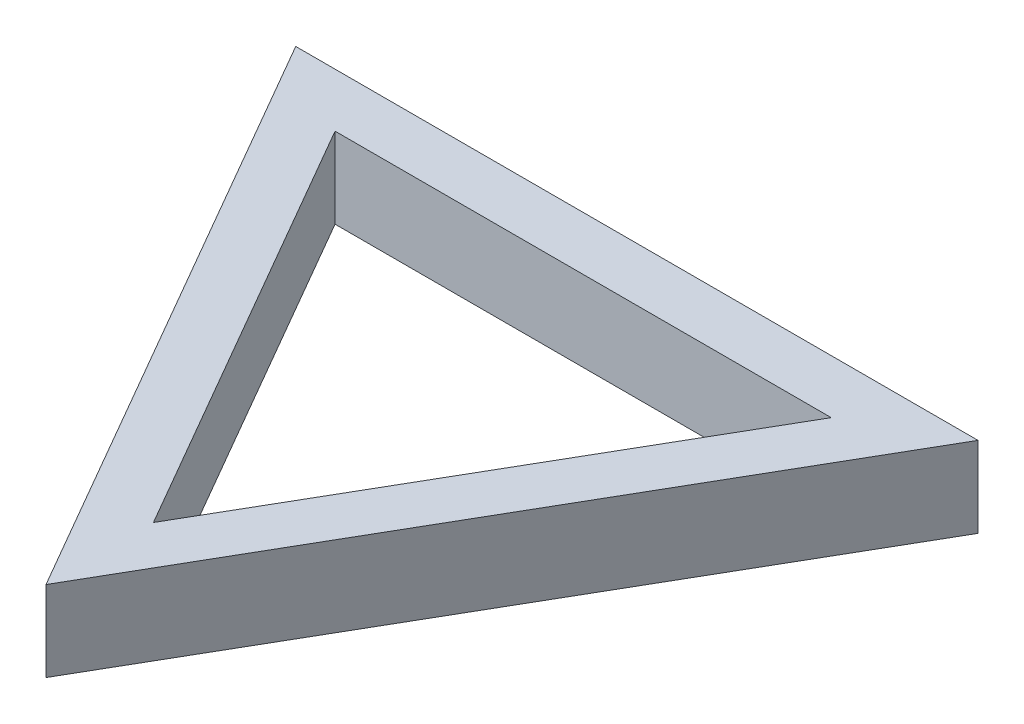
ISO-10303-21;
HEADER;
FILE_DESCRIPTION(('STEP AP214'),'2;1');
FILE_NAME('part.step','',(''),(''),'','','');
FILE_SCHEMA(('AUTOMOTIVE_DESIGN { 1 0 10303 214 1 1 1 1 }'));
ENDSEC;
DATA;
#1=APPLICATION_CONTEXT('core data for automotive mechanical design processes');
#2=APPLICATION_PROTOCOL_DEFINITION('international standard','automotive_design',2000,#1);
#3=PRODUCT_CONTEXT('',#1,'mechanical');
#4=PRODUCT('Part','Part','',(#3));
#5=PRODUCT_RELATED_PRODUCT_CATEGORY('part','',(#4));
#6=PRODUCT_DEFINITION_FORMATION('','',#4);
#7=PRODUCT_DEFINITION_CONTEXT('part definition',#1,'design');
#8=PRODUCT_DEFINITION('design','',#6,#7);
#9=PRODUCT_DEFINITION_SHAPE('','',#8);
#10=(LENGTH_UNIT() NAMED_UNIT(*) SI_UNIT(.MILLI.,.METRE.));
#11=(NAMED_UNIT(*) PLANE_ANGLE_UNIT() SI_UNIT($,.RADIAN.));
#12=(NAMED_UNIT(*) SI_UNIT($,.STERADIAN.) SOLID_ANGLE_UNIT());
#13=UNCERTAINTY_MEASURE_WITH_UNIT(LENGTH_MEASURE(1.E-05),#10,'distance_accuracy_value','');
#14=(GEOMETRIC_REPRESENTATION_CONTEXT(3) GLOBAL_UNCERTAINTY_ASSIGNED_CONTEXT((#13)) GLOBAL_UNIT_ASSIGNED_CONTEXT((#10,
#11,#12)) REPRESENTATION_CONTEXT('',''));
#15=CARTESIAN_POINT('',(0.,0.,0.));
#16=DIRECTION('',(0.,0.,1.));
#17=DIRECTION('',(1.,0.,0.));
#18=AXIS2_PLACEMENT_3D('',#15,#16,#17);
#19=CARTESIAN_POINT('',(51.1,0.,-86.5));
#20=DIRECTION('',(0.,-1.,0.));
#21=DIRECTION('',(0.,0.,-1.));
#22=AXIS2_PLACEMENT_3D('',#19,#20,#21);
#23=PLANE('',#22);
#24=DIRECTION('',(0.5,0.,-0.866025403784439));
#25=VECTOR('',#24,1.);
#26=CARTESIAN_POINT('',(17.1156859650492,0.,9.88174589928627));
#27=LINE('',#26,#25);
#28=CARTESIAN_POINT('',(20.2517059221718,0.,4.45000000000007));
#29=VERTEX_POINT('',#28);
#30=CARTESIAN_POINT('',(32.9534118443435,0.,-17.5499999999999));
#31=VERTEX_POINT('',#30);
#32=EDGE_CURVE('E128',#29,#31,#27,.T.);
#33=ORIENTED_EDGE('',*,*,#32,.T.);
#34=DIRECTION('',(1.,0.,0.));
#35=VECTOR('',#34,1.);
#36=CARTESIAN_POINT('',(0.,0.,-17.5499999999999));
#37=LINE('',#36,#35);
#38=CARTESIAN_POINT('',(7.55,0.,-17.5499999999999));
#39=VERTEX_POINT('',#38);
#40=EDGE_CURVE('E111',#39,#31,#37,.T.);
#41=ORIENTED_EDGE('',*,*,#40,.F.);
#42=DIRECTION('',(-0.5,0.,-0.866025403784439));
#43=VECTOR('',#42,1.);
#44=CARTESIAN_POINT('',(13.2618729182084,0.,-7.65674589928624));
#45=LINE('',#44,#43);
#46=EDGE_CURVE('E113',#29,#39,#45,.T.);
#47=ORIENTED_EDGE('',*,*,#46,.F.);
#48=EDGE_LOOP('',(#33,#41,#47));
#49=FACE_BOUND('',#48,.T.);
#50=DIRECTION('',(-0.5,0.,-0.866025403784439));
#51=VECTOR('',#50,1.);
#52=CARTESIAN_POINT('',(14.9939237257773,0.,-8.65674589928624));
#53=LINE('',#52,#51);
#54=CARTESIAN_POINT('',(20.2517059221718,0.,0.450000000000068));
#55=VERTEX_POINT('',#54);
#56=CARTESIAN_POINT('',(11.0141016151378,0.,-15.5499999999999));
#57=VERTEX_POINT('',#56);
#58=EDGE_CURVE('E11',#55,#57,#53,.T.);
#59=ORIENTED_EDGE('',*,*,#58,.T.);
#60=DIRECTION('',(1.,0.,0.));
#61=VECTOR('',#60,1.);
#62=CARTESIAN_POINT('',(0.,0.,-15.5499999999999));
#63=LINE('',#62,#61);
#64=CARTESIAN_POINT('',(29.4893102292058,0.,-15.5499999999999));
#65=VERTEX_POINT('',#64);
#66=EDGE_CURVE('E49',#57,#65,#63,.T.);
#67=ORIENTED_EDGE('',*,*,#66,.T.);
#68=DIRECTION('',(0.5,0.,-0.866025403784439));
#69=VECTOR('',#68,1.);
#70=CARTESIAN_POINT('',(15.3836351574804,0.,8.88174589928627));
#71=LINE('',#70,#69);
#72=EDGE_CURVE('E56',#55,#65,#71,.T.);
#73=ORIENTED_EDGE('',*,*,#72,.F.);
#74=EDGE_LOOP('',(#59,#67,#73));
#75=FACE_BOUND('',#74,.T.);
#76=ADVANCED_FACE('F41',(#49,#75),#23,.F.);
#77=CARTESIAN_POINT('',(15.3836351574804,-3.,8.88174589928627));
#78=DIRECTION('',(0.866025403784439,0.,0.5));
#79=DIRECTION('',(0.5,0.,-0.866025403784439));
#80=AXIS2_PLACEMENT_3D('',#77,#78,#79);
#81=PLANE('',#80);
#82=ORIENTED_EDGE('',*,*,#72,.T.);
#83=DIRECTION('',(0.,1.,0.));
#84=VECTOR('',#83,1.);
#85=CARTESIAN_POINT('',(29.4893102292058,-3.,-15.5499999999999));
#86=LINE('',#85,#84);
#87=CARTESIAN_POINT('',(29.4893102292058,-3.,-15.5499999999999));
#88=VERTEX_POINT('',#87);
#89=EDGE_CURVE('E101',#88,#65,#86,.T.);
#90=ORIENTED_EDGE('',*,*,#89,.F.);
#91=DIRECTION('',(0.5,0.,-0.866025403784439));
#92=VECTOR('',#91,1.);
#93=CARTESIAN_POINT('',(15.3836351574804,-3.,8.88174589928627));
#94=LINE('',#93,#92);
#95=CARTESIAN_POINT('',(20.2517059221718,-3.,0.450000000000068));
#96=VERTEX_POINT('',#95);
#97=EDGE_CURVE('E103',#96,#88,#94,.T.);
#98=ORIENTED_EDGE('',*,*,#97,.F.);
#99=DIRECTION('',(0.,1.,0.));
#100=VECTOR('',#99,1.);
#101=CARTESIAN_POINT('',(20.2517059221718,-3.,0.450000000000068));
#102=LINE('',#101,#100);
#103=EDGE_CURVE('E44',#96,#55,#102,.T.);
#104=ORIENTED_EDGE('',*,*,#103,.T.);
#105=EDGE_LOOP('',(#82,#90,#98,#104));
#106=FACE_BOUND('',#105,.T.);
#107=ADVANCED_FACE('F104',(#106),#81,.F.);
#108=CARTESIAN_POINT('',(13.2618729182084,-3.,-7.65674589928624));
#109=DIRECTION('',(0.866025403784439,0.,-0.5));
#110=DIRECTION('',(-0.5,0.,-0.866025403784439));
#111=AXIS2_PLACEMENT_3D('',#108,#109,#110);
#112=PLANE('',#111);
#113=ORIENTED_EDGE('',*,*,#46,.T.);
#114=DIRECTION('',(0.,1.,0.));
#115=VECTOR('',#114,1.);
#116=CARTESIAN_POINT('',(7.55,-3.,-17.5499999999999));
#117=LINE('',#116,#115);
#118=CARTESIAN_POINT('',(7.55,-3.,-17.5499999999999));
#119=VERTEX_POINT('',#118);
#120=EDGE_CURVE('E135',#119,#39,#117,.T.);
#121=ORIENTED_EDGE('',*,*,#120,.F.);
#122=DIRECTION('',(-0.5,0.,-0.866025403784439));
#123=VECTOR('',#122,1.);
#124=CARTESIAN_POINT('',(13.2618729182084,-3.,-7.65674589928624));
#125=LINE('',#124,#123);
#126=CARTESIAN_POINT('',(20.2517059221718,-3.,4.45000000000007));
#127=VERTEX_POINT('',#126);
#128=EDGE_CURVE('E120',#127,#119,#125,.T.);
#129=ORIENTED_EDGE('',*,*,#128,.F.);
#130=DIRECTION('',(0.,1.,0.));
#131=VECTOR('',#130,1.);
#132=CARTESIAN_POINT('',(20.2517059221718,-3.,4.45000000000007));
#133=LINE('',#132,#131);
#134=EDGE_CURVE('E131',#127,#29,#133,.T.);
#135=ORIENTED_EDGE('',*,*,#134,.T.);
#136=EDGE_LOOP('',(#113,#121,#129,#135));
#137=FACE_BOUND('',#136,.T.);
#138=ADVANCED_FACE('F155',(#137),#112,.F.);
#139=CARTESIAN_POINT('',(0.,-3.,0.));
#140=DIRECTION('',(0.,-1.,0.));
#141=DIRECTION('',(0.,0.,-1.));
#142=AXIS2_PLACEMENT_3D('',#139,#140,#141);
#143=PLANE('',#142);
#144=DIRECTION('',(-0.5,0.,-0.866025403784439));
#145=VECTOR('',#144,1.);
#146=CARTESIAN_POINT('',(14.9939237257773,-3.,-8.65674589928624));
#147=LINE('',#146,#145);
#148=CARTESIAN_POINT('',(11.0141016151378,-3.,-15.5499999999999));
#149=VERTEX_POINT('',#148);
#150=EDGE_CURVE('E97',#96,#149,#147,.T.);
#151=ORIENTED_EDGE('',*,*,#150,.F.);
#152=ORIENTED_EDGE('',*,*,#97,.T.);
#153=DIRECTION('',(1.,0.,0.));
#154=VECTOR('',#153,1.);
#155=CARTESIAN_POINT('',(0.,-3.,-15.5499999999999));
#156=LINE('',#155,#154);
#157=EDGE_CURVE('E107',#149,#88,#156,.T.);
#158=ORIENTED_EDGE('',*,*,#157,.F.);
#159=EDGE_LOOP('',(#151,#152,#158));
#160=FACE_BOUND('',#159,.T.);
#161=DIRECTION('',(0.5,0.,-0.866025403784439));
#162=VECTOR('',#161,1.);
#163=CARTESIAN_POINT('',(17.1156859650492,-3.,9.88174589928627));
#164=LINE('',#163,#162);
#165=CARTESIAN_POINT('',(32.9534118443435,-3.,-17.5499999999999));
#166=VERTEX_POINT('',#165);
#167=EDGE_CURVE('E117',#127,#166,#164,.T.);
#168=ORIENTED_EDGE('',*,*,#167,.F.);
#169=ORIENTED_EDGE('',*,*,#128,.T.);
#170=DIRECTION('',(1.,0.,0.));
#171=VECTOR('',#170,1.);
#172=CARTESIAN_POINT('',(0.,-3.,-17.5499999999999));
#173=LINE('',#172,#171);
#174=EDGE_CURVE('E123',#119,#166,#173,.T.);
#175=ORIENTED_EDGE('',*,*,#174,.T.);
#176=EDGE_LOOP('',(#168,#169,#175));
#177=FACE_BOUND('',#176,.T.);
#178=ADVANCED_FACE('F109',(#160,#177),#143,.T.);
#179=CARTESIAN_POINT('',(17.1156859650492,-3.,9.88174589928627));
#180=DIRECTION('',(0.866025403784439,0.,0.5));
#181=DIRECTION('',(0.5,0.,-0.866025403784439));
#182=AXIS2_PLACEMENT_3D('',#179,#180,#181);
#183=PLANE('',#182);
#184=ORIENTED_EDGE('',*,*,#32,.F.);
#185=ORIENTED_EDGE('',*,*,#134,.F.);
#186=ORIENTED_EDGE('',*,*,#167,.T.);
#187=DIRECTION('',(0.,1.,0.));
#188=VECTOR('',#187,1.);
#189=CARTESIAN_POINT('',(32.9534118443435,-3.,-17.5499999999999));
#190=LINE('',#189,#188);
#191=EDGE_CURVE('E100',#166,#31,#190,.T.);
#192=ORIENTED_EDGE('',*,*,#191,.T.);
#193=EDGE_LOOP('',(#184,#185,#186,#192));
#194=FACE_BOUND('',#193,.T.);
#195=ADVANCED_FACE('F160',(#194),#183,.T.);
#196=CARTESIAN_POINT('',(0.,-3.,-17.5499999999999));
#197=DIRECTION('',(0.,0.,1.));
#198=DIRECTION('',(1.,0.,0.));
#199=AXIS2_PLACEMENT_3D('',#196,#197,#198);
#200=PLANE('',#199);
#201=ORIENTED_EDGE('',*,*,#40,.T.);
#202=ORIENTED_EDGE('',*,*,#191,.F.);
#203=ORIENTED_EDGE('',*,*,#174,.F.);
#204=ORIENTED_EDGE('',*,*,#120,.T.);
#205=EDGE_LOOP('',(#201,#202,#203,#204));
#206=FACE_BOUND('',#205,.T.);
#207=ADVANCED_FACE('F146',(#206),#200,.F.);
#208=CARTESIAN_POINT('',(14.9939237257773,-3.,-8.65674589928624));
#209=DIRECTION('',(0.866025403784439,0.,-0.5));
#210=DIRECTION('',(-0.5,0.,-0.866025403784439));
#211=AXIS2_PLACEMENT_3D('',#208,#209,#210);
#212=PLANE('',#211);
#213=ORIENTED_EDGE('',*,*,#58,.F.);
#214=ORIENTED_EDGE('',*,*,#103,.F.);
#215=ORIENTED_EDGE('',*,*,#150,.T.);
#216=DIRECTION('',(0.,1.,0.));
#217=VECTOR('',#216,1.);
#218=CARTESIAN_POINT('',(11.0141016151378,-3.,-15.5499999999999));
#219=LINE('',#218,#217);
#220=EDGE_CURVE('E124',#149,#57,#219,.T.);
#221=ORIENTED_EDGE('',*,*,#220,.T.);
#222=EDGE_LOOP('',(#213,#214,#215,#221));
#223=FACE_BOUND('',#222,.T.);
#224=ADVANCED_FACE('F94',(#223),#212,.T.);
#225=CARTESIAN_POINT('',(0.,-3.,-15.5499999999999));
#226=DIRECTION('',(0.,0.,1.));
#227=DIRECTION('',(1.,0.,0.));
#228=AXIS2_PLACEMENT_3D('',#225,#226,#227);
#229=PLANE('',#228);
#230=ORIENTED_EDGE('',*,*,#66,.F.);
#231=ORIENTED_EDGE('',*,*,#220,.F.);
#232=ORIENTED_EDGE('',*,*,#157,.T.);
#233=ORIENTED_EDGE('',*,*,#89,.T.);
#234=EDGE_LOOP('',(#230,#231,#232,#233));
#235=FACE_BOUND('',#234,.T.);
#236=ADVANCED_FACE('F140',(#235),#229,.T.);
#237=CLOSED_SHELL('',(#76,#107,#138,#178,#195,#207,#224,#236));
#238=MANIFOLD_SOLID_BREP('B2',#237);
#239=ADVANCED_BREP_SHAPE_REPRESENTATION('',(#18,#238),#14);
#240=SHAPE_DEFINITION_REPRESENTATION(#9,#239);
ENDSEC;
END-ISO-10303-21;
